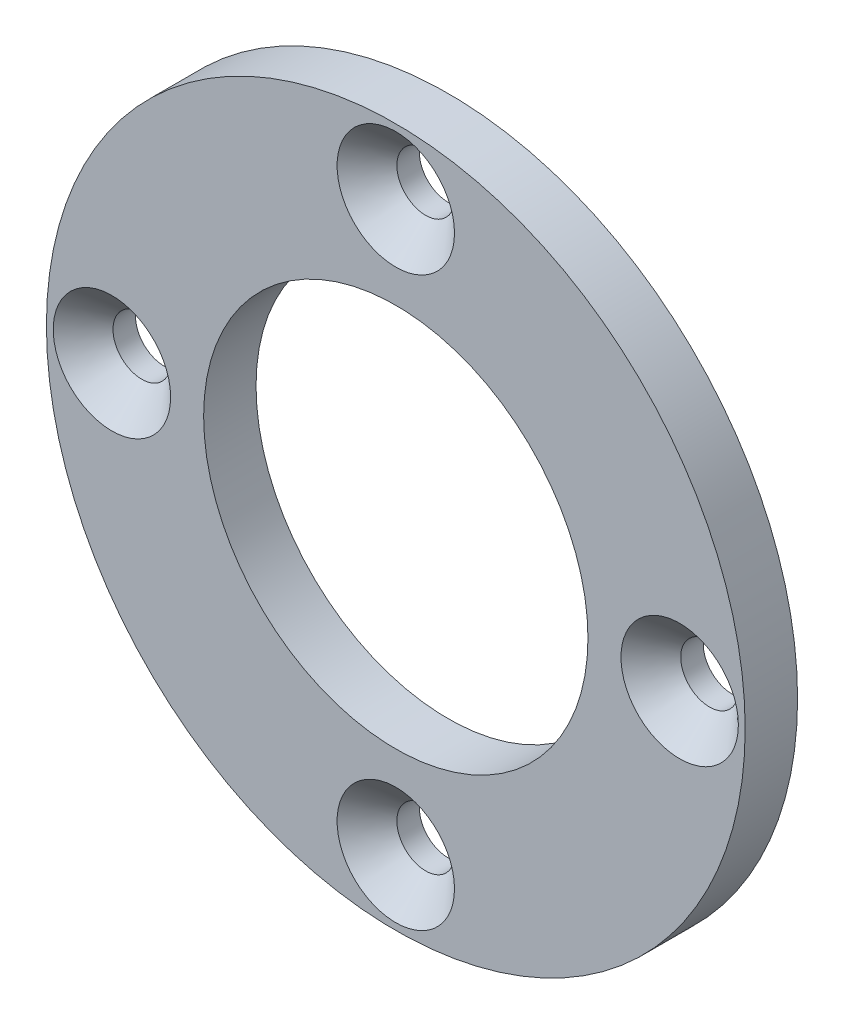
ISO-10303-21;
HEADER;
FILE_DESCRIPTION(('STEP AP214'),'2;1');
FILE_NAME('part.step','',(''),(''),'','','');
FILE_SCHEMA(('AUTOMOTIVE_DESIGN { 1 0 10303 214 1 1 1 1 }'));
ENDSEC;
DATA;
#1=APPLICATION_CONTEXT('core data for automotive mechanical design processes');
#2=APPLICATION_PROTOCOL_DEFINITION('international standard','automotive_design',2000,#1);
#3=PRODUCT_CONTEXT('',#1,'mechanical');
#4=PRODUCT('Part','Part','',(#3));
#5=PRODUCT_RELATED_PRODUCT_CATEGORY('part','',(#4));
#6=PRODUCT_DEFINITION_FORMATION('','',#4);
#7=PRODUCT_DEFINITION_CONTEXT('part definition',#1,'design');
#8=PRODUCT_DEFINITION('design','',#6,#7);
#9=PRODUCT_DEFINITION_SHAPE('','',#8);
#10=(LENGTH_UNIT() NAMED_UNIT(*) SI_UNIT(.MILLI.,.METRE.));
#11=(NAMED_UNIT(*) PLANE_ANGLE_UNIT() SI_UNIT($,.RADIAN.));
#12=(NAMED_UNIT(*) SI_UNIT($,.STERADIAN.) SOLID_ANGLE_UNIT());
#13=UNCERTAINTY_MEASURE_WITH_UNIT(LENGTH_MEASURE(1.E-05),#10,'distance_accuracy_value','');
#14=(GEOMETRIC_REPRESENTATION_CONTEXT(3) GLOBAL_UNCERTAINTY_ASSIGNED_CONTEXT((#13)) GLOBAL_UNIT_ASSIGNED_CONTEXT((#10,
#11,#12)) REPRESENTATION_CONTEXT('',''));
#15=CARTESIAN_POINT('',(0.,0.,0.));
#16=DIRECTION('',(0.,0.,1.));
#17=DIRECTION('',(1.,0.,0.));
#18=AXIS2_PLACEMENT_3D('',#15,#16,#17);
#19=CARTESIAN_POINT('',(0.,0.,6.));
#20=DIRECTION('',(0.,0.,1.));
#21=DIRECTION('',(1.,0.,0.));
#22=AXIS2_PLACEMENT_3D('',#19,#20,#21);
#23=PLANE('',#22);
#24=CARTESIAN_POINT('',(0.,32.5,6.));
#25=DIRECTION('',(0.,0.,1.));
#26=DIRECTION('',(1.,0.,0.));
#27=AXIS2_PLACEMENT_3D('',#24,#25,#26);
#28=CIRCLE('',#27,6.72);
#29=CARTESIAN_POINT('',(6.72,32.5,6.));
#30=VERTEX_POINT('',#29);
#31=EDGE_CURVE('E85',#30,#30,#28,.T.);
#32=ORIENTED_EDGE('',*,*,#31,.F.);
#33=EDGE_LOOP('',(#32));
#34=FACE_BOUND('',#33,.T.);
#35=CARTESIAN_POINT('',(-32.5,0.,6.));
#36=DIRECTION('',(0.,0.,1.));
#37=DIRECTION('',(1.,0.,0.));
#38=AXIS2_PLACEMENT_3D('',#35,#36,#37);
#39=CIRCLE('',#38,6.72);
#40=CARTESIAN_POINT('',(-25.78,0.,6.));
#41=VERTEX_POINT('',#40);
#42=EDGE_CURVE('E76',#41,#41,#39,.T.);
#43=ORIENTED_EDGE('',*,*,#42,.F.);
#44=EDGE_LOOP('',(#43));
#45=FACE_BOUND('',#44,.T.);
#46=CARTESIAN_POINT('',(0.,-32.5,6.));
#47=DIRECTION('',(0.,0.,1.));
#48=DIRECTION('',(1.,0.,0.));
#49=AXIS2_PLACEMENT_3D('',#46,#47,#48);
#50=CIRCLE('',#49,6.72);
#51=CARTESIAN_POINT('',(6.72,-32.5,6.));
#52=VERTEX_POINT('',#51);
#53=EDGE_CURVE('E67',#52,#52,#50,.T.);
#54=ORIENTED_EDGE('',*,*,#53,.F.);
#55=EDGE_LOOP('',(#54));
#56=FACE_BOUND('',#55,.T.);
#57=CARTESIAN_POINT('',(32.5,0.,6.));
#58=DIRECTION('',(0.,0.,1.));
#59=DIRECTION('',(1.,0.,0.));
#60=AXIS2_PLACEMENT_3D('',#57,#58,#59);
#61=CIRCLE('',#60,6.72);
#62=CARTESIAN_POINT('',(39.22,0.,6.));
#63=VERTEX_POINT('',#62);
#64=EDGE_CURVE('E58',#63,#63,#61,.T.);
#65=ORIENTED_EDGE('',*,*,#64,.F.);
#66=EDGE_LOOP('',(#65));
#67=FACE_BOUND('',#66,.T.);
#68=CARTESIAN_POINT('',(0.,0.,6.));
#69=DIRECTION('',(0.,0.,1.));
#70=DIRECTION('',(1.,0.,0.));
#71=AXIS2_PLACEMENT_3D('',#68,#69,#70);
#72=CIRCLE('',#71,40.);
#73=CARTESIAN_POINT('',(40.,0.,6.));
#74=VERTEX_POINT('',#73);
#75=EDGE_CURVE('E10',#74,#74,#72,.T.);
#76=ORIENTED_EDGE('',*,*,#75,.T.);
#77=EDGE_LOOP('',(#76));
#78=FACE_BOUND('',#77,.T.);
#79=CARTESIAN_POINT('',(0.,0.,6.));
#80=DIRECTION('',(0.,0.,1.));
#81=DIRECTION('',(1.,0.,0.));
#82=AXIS2_PLACEMENT_3D('',#79,#80,#81);
#83=CIRCLE('',#82,22.);
#84=CARTESIAN_POINT('',(22.,0.,6.));
#85=VERTEX_POINT('',#84);
#86=EDGE_CURVE('E45',#85,#85,#83,.T.);
#87=ORIENTED_EDGE('',*,*,#86,.F.);
#88=EDGE_LOOP('',(#87));
#89=FACE_BOUND('',#88,.T.);
#90=ADVANCED_FACE('F34',(#34,#45,#56,#67,#78,#89),#23,.T.);
#91=CARTESIAN_POINT('',(0.,0.,0.));
#92=DIRECTION('',(0.,0.,1.));
#93=DIRECTION('',(1.,0.,0.));
#94=AXIS2_PLACEMENT_3D('',#91,#92,#93);
#95=PLANE('',#94);
#96=CARTESIAN_POINT('',(0.,32.5,0.));
#97=DIRECTION('',(0.,0.,1.));
#98=DIRECTION('',(1.,0.,0.));
#99=AXIS2_PLACEMENT_3D('',#96,#97,#98);
#100=CIRCLE('',#99,3.29999999999999);
#101=CARTESIAN_POINT('',(3.29999999999999,32.5,0.));
#102=VERTEX_POINT('',#101);
#103=EDGE_CURVE('E79',#102,#102,#100,.T.);
#104=ORIENTED_EDGE('',*,*,#103,.T.);
#105=EDGE_LOOP('',(#104));
#106=FACE_BOUND('',#105,.T.);
#107=CARTESIAN_POINT('',(-32.5,0.,0.));
#108=DIRECTION('',(0.,0.,1.));
#109=DIRECTION('',(1.,0.,0.));
#110=AXIS2_PLACEMENT_3D('',#107,#108,#109);
#111=CIRCLE('',#110,3.29999999999999);
#112=CARTESIAN_POINT('',(-29.2,0.,0.));
#113=VERTEX_POINT('',#112);
#114=EDGE_CURVE('E70',#113,#113,#111,.T.);
#115=ORIENTED_EDGE('',*,*,#114,.T.);
#116=EDGE_LOOP('',(#115));
#117=FACE_BOUND('',#116,.T.);
#118=CARTESIAN_POINT('',(0.,-32.5,0.));
#119=DIRECTION('',(0.,0.,1.));
#120=DIRECTION('',(1.,0.,0.));
#121=AXIS2_PLACEMENT_3D('',#118,#119,#120);
#122=CIRCLE('',#121,3.29999999999999);
#123=CARTESIAN_POINT('',(3.29999999999999,-32.5,0.));
#124=VERTEX_POINT('',#123);
#125=EDGE_CURVE('E61',#124,#124,#122,.T.);
#126=ORIENTED_EDGE('',*,*,#125,.T.);
#127=EDGE_LOOP('',(#126));
#128=FACE_BOUND('',#127,.T.);
#129=CARTESIAN_POINT('',(32.5,0.,0.));
#130=DIRECTION('',(0.,0.,1.));
#131=DIRECTION('',(1.,0.,0.));
#132=AXIS2_PLACEMENT_3D('',#129,#130,#131);
#133=CIRCLE('',#132,3.29999999999998);
#134=CARTESIAN_POINT('',(35.8,0.,0.));
#135=VERTEX_POINT('',#134);
#136=EDGE_CURVE('E50',#135,#135,#133,.T.);
#137=ORIENTED_EDGE('',*,*,#136,.T.);
#138=EDGE_LOOP('',(#137));
#139=FACE_BOUND('',#138,.T.);
#140=CARTESIAN_POINT('',(0.,0.,0.));
#141=DIRECTION('',(0.,0.,1.));
#142=DIRECTION('',(1.,0.,0.));
#143=AXIS2_PLACEMENT_3D('',#140,#141,#142);
#144=CIRCLE('',#143,40.);
#145=CARTESIAN_POINT('',(40.,0.,0.));
#146=VERTEX_POINT('',#145);
#147=EDGE_CURVE('E38',#146,#146,#144,.T.);
#148=ORIENTED_EDGE('',*,*,#147,.F.);
#149=EDGE_LOOP('',(#148));
#150=FACE_BOUND('',#149,.T.);
#151=CARTESIAN_POINT('',(0.,0.,0.));
#152=DIRECTION('',(0.,0.,1.));
#153=DIRECTION('',(1.,0.,0.));
#154=AXIS2_PLACEMENT_3D('',#151,#152,#153);
#155=CIRCLE('',#154,22.);
#156=CARTESIAN_POINT('',(22.,0.,0.));
#157=VERTEX_POINT('',#156);
#158=EDGE_CURVE('E47',#157,#157,#155,.T.);
#159=ORIENTED_EDGE('',*,*,#158,.T.);
#160=EDGE_LOOP('',(#159));
#161=FACE_BOUND('',#160,.T.);
#162=ADVANCED_FACE('F93',(#106,#117,#128,#139,#150,#161),#95,.F.);
#163=CARTESIAN_POINT('',(0.,0.,6.));
#164=DIRECTION('',(0.,0.,-1.));
#165=DIRECTION('',(-1.,0.,0.));
#166=AXIS2_PLACEMENT_3D('',#163,#164,#165);
#167=CYLINDRICAL_SURFACE('',#166,40.);
#168=ORIENTED_EDGE('',*,*,#75,.F.);
#169=EDGE_LOOP('',(#168));
#170=FACE_BOUND('',#169,.T.);
#171=ORIENTED_EDGE('',*,*,#147,.T.);
#172=EDGE_LOOP('',(#171));
#173=FACE_BOUND('',#172,.T.);
#174=ADVANCED_FACE('F36',(#170,#173),#167,.T.);
#175=CARTESIAN_POINT('',(0.,0.,6.));
#176=DIRECTION('',(0.,0.,-1.));
#177=DIRECTION('',(-1.,0.,0.));
#178=AXIS2_PLACEMENT_3D('',#175,#176,#177);
#179=CYLINDRICAL_SURFACE('',#178,22.);
#180=ORIENTED_EDGE('',*,*,#86,.T.);
#181=EDGE_LOOP('',(#180));
#182=FACE_BOUND('',#181,.T.);
#183=ORIENTED_EDGE('',*,*,#158,.F.);
#184=EDGE_LOOP('',(#183));
#185=FACE_BOUND('',#184,.T.);
#186=ADVANCED_FACE('F103',(#182,#185),#179,.F.);
#187=CARTESIAN_POINT('',(32.5,0.,6.));
#188=DIRECTION('',(0.,0.,1.));
#189=DIRECTION('',(1.,0.,0.));
#190=AXIS2_PLACEMENT_3D('',#187,#188,#189);
#191=CYLINDRICAL_SURFACE('',#190,3.29999999999999);
#192=ORIENTED_EDGE('',*,*,#136,.F.);
#193=EDGE_LOOP('',(#192));
#194=FACE_BOUND('',#193,.T.);
#195=CARTESIAN_POINT('',(32.5,0.,2.58));
#196=DIRECTION('',(0.,0.,1.));
#197=DIRECTION('',(1.,0.,0.));
#198=AXIS2_PLACEMENT_3D('',#195,#196,#197);
#199=CIRCLE('',#198,3.3);
#200=CARTESIAN_POINT('',(35.8,0.,2.58));
#201=VERTEX_POINT('',#200);
#202=EDGE_CURVE('E55',#201,#201,#199,.T.);
#203=ORIENTED_EDGE('',*,*,#202,.T.);
#204=EDGE_LOOP('',(#203));
#205=FACE_BOUND('',#204,.T.);
#206=ADVANCED_FACE('F106',(#194,#205),#191,.F.);
#207=CARTESIAN_POINT('',(32.5,0.,6.));
#208=DIRECTION('',(0.,0.,1.));
#209=DIRECTION('',(1.,0.,0.));
#210=AXIS2_PLACEMENT_3D('',#207,#208,#209);
#211=CONICAL_SURFACE('',#210,6.72,0.785398163397449);
#212=ORIENTED_EDGE('',*,*,#202,.F.);
#213=EDGE_LOOP('',(#212));
#214=FACE_BOUND('',#213,.T.);
#215=ORIENTED_EDGE('',*,*,#64,.T.);
#216=EDGE_LOOP('',(#215));
#217=FACE_BOUND('',#216,.T.);
#218=ADVANCED_FACE('F120',(#214,#217),#211,.F.);
#219=CARTESIAN_POINT('',(0.,-32.5,6.));
#220=DIRECTION('',(0.,0.,1.));
#221=DIRECTION('',(1.,0.,0.));
#222=AXIS2_PLACEMENT_3D('',#219,#220,#221);
#223=CYLINDRICAL_SURFACE('',#222,3.29999999999999);
#224=ORIENTED_EDGE('',*,*,#125,.F.);
#225=EDGE_LOOP('',(#224));
#226=FACE_BOUND('',#225,.T.);
#227=CARTESIAN_POINT('',(0.,-32.5,2.58));
#228=DIRECTION('',(0.,0.,1.));
#229=DIRECTION('',(1.,0.,0.));
#230=AXIS2_PLACEMENT_3D('',#227,#228,#229);
#231=CIRCLE('',#230,3.3);
#232=CARTESIAN_POINT('',(3.3,-32.5,2.58));
#233=VERTEX_POINT('',#232);
#234=EDGE_CURVE('E64',#233,#233,#231,.T.);
#235=ORIENTED_EDGE('',*,*,#234,.T.);
#236=EDGE_LOOP('',(#235));
#237=FACE_BOUND('',#236,.T.);
#238=ADVANCED_FACE('F124',(#226,#237),#223,.F.);
#239=CARTESIAN_POINT('',(0.,-32.5,6.));
#240=DIRECTION('',(0.,0.,1.));
#241=DIRECTION('',(1.,0.,0.));
#242=AXIS2_PLACEMENT_3D('',#239,#240,#241);
#243=CONICAL_SURFACE('',#242,6.72,0.785398163397449);
#244=ORIENTED_EDGE('',*,*,#234,.F.);
#245=EDGE_LOOP('',(#244));
#246=FACE_BOUND('',#245,.T.);
#247=ORIENTED_EDGE('',*,*,#53,.T.);
#248=EDGE_LOOP('',(#247));
#249=FACE_BOUND('',#248,.T.);
#250=ADVANCED_FACE('F128',(#246,#249),#243,.F.);
#251=CARTESIAN_POINT('',(-32.5,0.,6.));
#252=DIRECTION('',(0.,0.,1.));
#253=DIRECTION('',(1.,0.,0.));
#254=AXIS2_PLACEMENT_3D('',#251,#252,#253);
#255=CYLINDRICAL_SURFACE('',#254,3.29999999999999);
#256=ORIENTED_EDGE('',*,*,#114,.F.);
#257=EDGE_LOOP('',(#256));
#258=FACE_BOUND('',#257,.T.);
#259=CARTESIAN_POINT('',(-32.5,0.,2.58));
#260=DIRECTION('',(0.,0.,1.));
#261=DIRECTION('',(1.,0.,0.));
#262=AXIS2_PLACEMENT_3D('',#259,#260,#261);
#263=CIRCLE('',#262,3.3);
#264=CARTESIAN_POINT('',(-29.2,0.,2.58));
#265=VERTEX_POINT('',#264);
#266=EDGE_CURVE('E73',#265,#265,#263,.T.);
#267=ORIENTED_EDGE('',*,*,#266,.T.);
#268=EDGE_LOOP('',(#267));
#269=FACE_BOUND('',#268,.T.);
#270=ADVANCED_FACE('F132',(#258,#269),#255,.F.);
#271=CARTESIAN_POINT('',(-32.5,0.,6.));
#272=DIRECTION('',(0.,0.,1.));
#273=DIRECTION('',(1.,0.,0.));
#274=AXIS2_PLACEMENT_3D('',#271,#272,#273);
#275=CONICAL_SURFACE('',#274,6.72,0.785398163397449);
#276=ORIENTED_EDGE('',*,*,#266,.F.);
#277=EDGE_LOOP('',(#276));
#278=FACE_BOUND('',#277,.T.);
#279=ORIENTED_EDGE('',*,*,#42,.T.);
#280=EDGE_LOOP('',(#279));
#281=FACE_BOUND('',#280,.T.);
#282=ADVANCED_FACE('F136',(#278,#281),#275,.F.);
#283=CARTESIAN_POINT('',(0.,32.5,6.));
#284=DIRECTION('',(0.,0.,1.));
#285=DIRECTION('',(1.,0.,0.));
#286=AXIS2_PLACEMENT_3D('',#283,#284,#285);
#287=CYLINDRICAL_SURFACE('',#286,3.29999999999999);
#288=ORIENTED_EDGE('',*,*,#103,.F.);
#289=EDGE_LOOP('',(#288));
#290=FACE_BOUND('',#289,.T.);
#291=CARTESIAN_POINT('',(0.,32.5,2.58));
#292=DIRECTION('',(0.,0.,1.));
#293=DIRECTION('',(1.,0.,0.));
#294=AXIS2_PLACEMENT_3D('',#291,#292,#293);
#295=CIRCLE('',#294,3.3);
#296=CARTESIAN_POINT('',(3.3,32.5,2.58));
#297=VERTEX_POINT('',#296);
#298=EDGE_CURVE('E82',#297,#297,#295,.T.);
#299=ORIENTED_EDGE('',*,*,#298,.T.);
#300=EDGE_LOOP('',(#299));
#301=FACE_BOUND('',#300,.T.);
#302=ADVANCED_FACE('F140',(#290,#301),#287,.F.);
#303=CARTESIAN_POINT('',(0.,32.5,6.));
#304=DIRECTION('',(0.,0.,1.));
#305=DIRECTION('',(1.,0.,0.));
#306=AXIS2_PLACEMENT_3D('',#303,#304,#305);
#307=CONICAL_SURFACE('',#306,6.72,0.785398163397449);
#308=ORIENTED_EDGE('',*,*,#298,.F.);
#309=EDGE_LOOP('',(#308));
#310=FACE_BOUND('',#309,.T.);
#311=ORIENTED_EDGE('',*,*,#31,.T.);
#312=EDGE_LOOP('',(#311));
#313=FACE_BOUND('',#312,.T.);
#314=ADVANCED_FACE('F89',(#310,#313),#307,.F.);
#315=CLOSED_SHELL('',(#90,#162,#174,#186,#206,#218,#238,#250,#270,#282,#302,#314));
#316=MANIFOLD_SOLID_BREP('B2',#315);
#317=ADVANCED_BREP_SHAPE_REPRESENTATION('',(#18,#316),#14);
#318=SHAPE_DEFINITION_REPRESENTATION(#9,#317);
ENDSEC;
END-ISO-10303-21;
